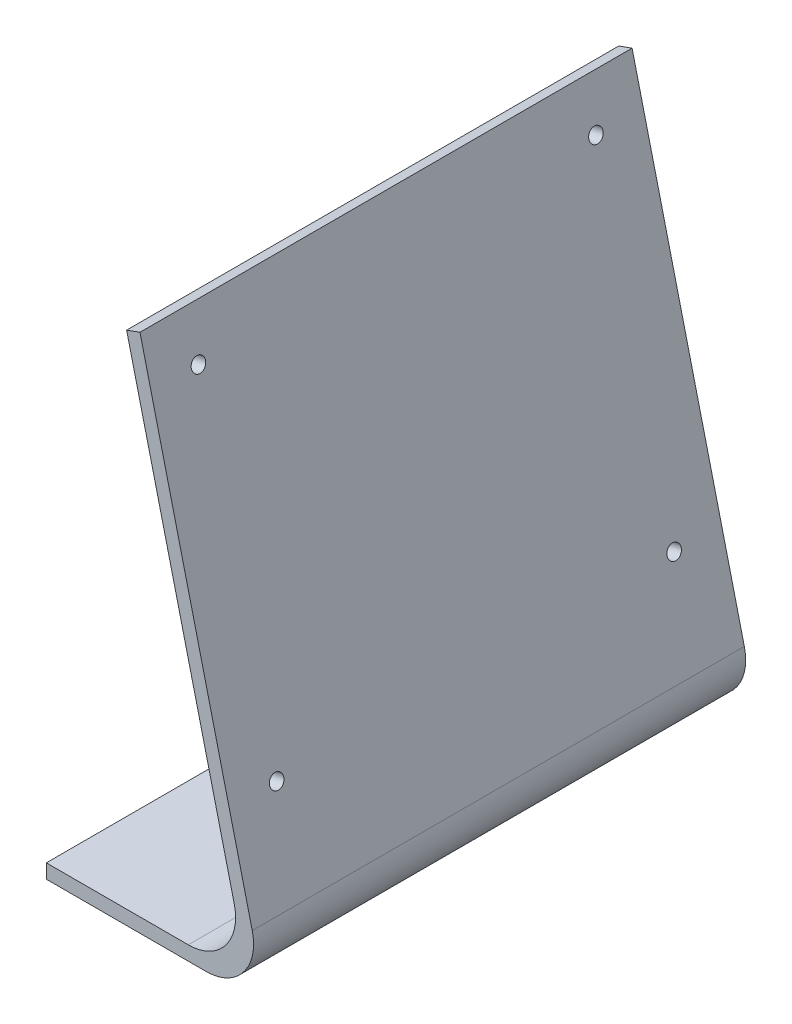
ISO-10303-21;
HEADER;
FILE_DESCRIPTION(('STEP AP214'),'2;1');
FILE_NAME('part.step','',(''),(''),'','','');
FILE_SCHEMA(('AUTOMOTIVE_DESIGN { 1 0 10303 214 1 1 1 1 }'));
ENDSEC;
DATA;
#1=APPLICATION_CONTEXT('core data for automotive mechanical design processes');
#2=APPLICATION_PROTOCOL_DEFINITION('international standard','automotive_design',2000,#1);
#3=PRODUCT_CONTEXT('',#1,'mechanical');
#4=PRODUCT('Part','Part','',(#3));
#5=PRODUCT_RELATED_PRODUCT_CATEGORY('part','',(#4));
#6=PRODUCT_DEFINITION_FORMATION('','',#4);
#7=PRODUCT_DEFINITION_CONTEXT('part definition',#1,'design');
#8=PRODUCT_DEFINITION('design','',#6,#7);
#9=PRODUCT_DEFINITION_SHAPE('','',#8);
#10=(LENGTH_UNIT() NAMED_UNIT(*) SI_UNIT(.MILLI.,.METRE.));
#11=(NAMED_UNIT(*) PLANE_ANGLE_UNIT() SI_UNIT($,.RADIAN.));
#12=(NAMED_UNIT(*) SI_UNIT($,.STERADIAN.) SOLID_ANGLE_UNIT());
#13=UNCERTAINTY_MEASURE_WITH_UNIT(LENGTH_MEASURE(1.E-05),#10,'distance_accuracy_value','');
#14=(GEOMETRIC_REPRESENTATION_CONTEXT(3) GLOBAL_UNCERTAINTY_ASSIGNED_CONTEXT((#13)) GLOBAL_UNIT_ASSIGNED_CONTEXT((#10,
#11,#12)) REPRESENTATION_CONTEXT('',''));
#15=CARTESIAN_POINT('',(0.,0.,0.));
#16=DIRECTION('',(0.,0.,1.));
#17=DIRECTION('',(1.,0.,0.));
#18=AXIS2_PLACEMENT_3D('',#15,#16,#17);
#19=CARTESIAN_POINT('',(-50.5300048316959,0.,52.));
#20=DIRECTION('',(0.,1.,0.));
#21=DIRECTION('',(0.,0.,1.));
#22=AXIS2_PLACEMENT_3D('',#19,#20,#21);
#23=PLANE('',#22);
#24=DIRECTION('',(1.,0.,0.));
#25=VECTOR('',#24,1.);
#26=CARTESIAN_POINT('',(-50.5300048316959,0.,-52.));
#27=LINE('',#26,#25);
#28=CARTESIAN_POINT('',(-50.5300048316959,0.,-52.));
#29=VERTEX_POINT('',#28);
#30=CARTESIAN_POINT('',(-16.7318655245927,0.,-52.));
#31=VERTEX_POINT('',#30);
#32=EDGE_CURVE('E133',#29,#31,#27,.T.);
#33=ORIENTED_EDGE('',*,*,#32,.T.);
#34=DIRECTION('',(0.,0.,-1.));
#35=VECTOR('',#34,1.);
#36=CARTESIAN_POINT('',(-16.7318655245927,0.,52.));
#37=LINE('',#36,#35);
#38=CARTESIAN_POINT('',(-16.7318655245927,0.,52.));
#39=VERTEX_POINT('',#38);
#40=EDGE_CURVE('E11',#39,#31,#37,.T.);
#41=ORIENTED_EDGE('',*,*,#40,.F.);
#42=DIRECTION('',(1.,0.,0.));
#43=VECTOR('',#42,1.);
#44=CARTESIAN_POINT('',(-50.5300048316959,0.,52.));
#45=LINE('',#44,#43);
#46=CARTESIAN_POINT('',(-50.5300048316959,0.,52.));
#47=VERTEX_POINT('',#46);
#48=EDGE_CURVE('E148',#47,#39,#45,.T.);
#49=ORIENTED_EDGE('',*,*,#48,.F.);
#50=DIRECTION('',(0.,0.,-1.));
#51=VECTOR('',#50,1.);
#52=CARTESIAN_POINT('',(-50.5300048316959,0.,52.));
#53=LINE('',#52,#51);
#54=EDGE_CURVE('E129',#47,#29,#53,.T.);
#55=ORIENTED_EDGE('',*,*,#54,.T.);
#56=EDGE_LOOP('',(#33,#41,#49,#55));
#57=FACE_BOUND('',#56,.T.);
#58=ADVANCED_FACE('F37',(#57),#23,.F.);
#59=CARTESIAN_POINT('',(-16.7318655245927,10.,52.));
#60=DIRECTION('',(0.,0.,-1.));
#61=DIRECTION('',(-1.,0.,0.));
#62=AXIS2_PLACEMENT_3D('',#59,#60,#61);
#63=CYLINDRICAL_SURFACE('',#62,10.);
#64=CARTESIAN_POINT('',(-16.7318655245927,10.,-52.));
#65=DIRECTION('',(0.,0.,1.));
#66=DIRECTION('',(1.,0.,0.));
#67=AXIS2_PLACEMENT_3D('',#64,#65,#66);
#68=CIRCLE('',#67,10.);
#69=CARTESIAN_POINT('',(-7.01457857653921,12.3610028312541,-52.));
#70=VERTEX_POINT('',#69);
#71=EDGE_CURVE('E136',#31,#70,#68,.T.);
#72=ORIENTED_EDGE('',*,*,#71,.T.);
#73=DIRECTION('',(0.,0.,-1.));
#74=VECTOR('',#73,1.);
#75=CARTESIAN_POINT('',(-7.01457857653921,12.3610028312541,52.));
#76=LINE('',#75,#74);
#77=CARTESIAN_POINT('',(-7.01457857653921,12.3610028312541,52.));
#78=VERTEX_POINT('',#77);
#79=EDGE_CURVE('E45',#78,#70,#76,.T.);
#80=ORIENTED_EDGE('',*,*,#79,.F.);
#81=CARTESIAN_POINT('',(-16.7318655245927,10.,52.));
#82=DIRECTION('',(0.,0.,1.));
#83=DIRECTION('',(1.,0.,0.));
#84=AXIS2_PLACEMENT_3D('',#81,#82,#83);
#85=CIRCLE('',#84,10.);
#86=EDGE_CURVE('E96',#39,#78,#85,.T.);
#87=ORIENTED_EDGE('',*,*,#86,.F.);
#88=ORIENTED_EDGE('',*,*,#40,.T.);
#89=EDGE_LOOP('',(#72,#80,#87,#88));
#90=FACE_BOUND('',#89,.T.);
#91=ADVANCED_FACE('F210',(#90),#63,.T.);
#92=CARTESIAN_POINT('',(-7.01457857653921,12.3610028312541,52.));
#93=DIRECTION('',(-0.971728694805345,-0.236100283125413,0.));
#94=DIRECTION('',(0.236100283125413,-0.971728694805346,0.));
#95=AXIS2_PLACEMENT_3D('',#92,#93,#94);
#96=PLANE('',#95);
#97=CARTESIAN_POINT('',(-11.8498389774818,32.2617044155723,42.));
#98=DIRECTION('',(0.971728694805345,0.236100283125413,0.));
#99=DIRECTION('',(0.236100283125413,-0.971728694805346,0.));
#100=AXIS2_PLACEMENT_3D('',#97,#98,#99);
#101=CIRCLE('',#100,1.5);
#102=CARTESIAN_POINT('',(-12.2039894021699,33.7192974577804,42.));
#103=VERTEX_POINT('',#102);
#104=EDGE_CURVE('E191',#103,#103,#101,.T.);
#105=ORIENTED_EDGE('',*,*,#104,.F.);
#106=EDGE_LOOP('',(#105));
#107=FACE_BOUND('',#106,.T.);
#108=CARTESIAN_POINT('',(-11.8498389774818,32.2617044155724,-42.));
#109=DIRECTION('',(0.971728694805345,0.236100283125413,0.));
#110=DIRECTION('',(-0.236100283125413,0.971728694805346,0.));
#111=AXIS2_PLACEMENT_3D('',#108,#109,#110);
#112=CIRCLE('',#111,1.5);
#113=CARTESIAN_POINT('',(-12.2039894021699,33.7192974577804,-42.));
#114=VERTEX_POINT('',#113);
#115=EDGE_CURVE('E190',#114,#114,#112,.T.);
#116=ORIENTED_EDGE('',*,*,#115,.F.);
#117=EDGE_LOOP('',(#116));
#118=FACE_BOUND('',#117,.T.);
#119=CARTESIAN_POINT('',(-28.3768587962607,100.282713051947,-42.));
#120=DIRECTION('',(0.971728694805345,0.236100283125413,0.));
#121=DIRECTION('',(0.236100283125413,-0.971728694805346,0.));
#122=AXIS2_PLACEMENT_3D('',#119,#120,#121);
#123=CIRCLE('',#122,1.5);
#124=CARTESIAN_POINT('',(-28.7310092209488,101.740306094155,-42.));
#125=VERTEX_POINT('',#124);
#126=EDGE_CURVE('E197',#125,#125,#123,.T.);
#127=ORIENTED_EDGE('',*,*,#126,.F.);
#128=EDGE_LOOP('',(#127));
#129=FACE_BOUND('',#128,.T.);
#130=CARTESIAN_POINT('',(-28.3768587962607,100.282713051947,42.));
#131=DIRECTION('',(0.971728694805345,0.236100283125413,0.));
#132=DIRECTION('',(-0.236100283125413,0.971728694805346,0.));
#133=AXIS2_PLACEMENT_3D('',#130,#131,#132);
#134=CIRCLE('',#133,1.5);
#135=CARTESIAN_POINT('',(-28.7310092209488,101.740306094155,42.));
#136=VERTEX_POINT('',#135);
#137=EDGE_CURVE('E183',#136,#136,#134,.T.);
#138=ORIENTED_EDGE('',*,*,#137,.F.);
#139=EDGE_LOOP('',(#138));
#140=FACE_BOUND('',#139,.T.);
#141=DIRECTION('',(-0.236100283125413,0.971728694805345,0.));
#142=VECTOR('',#141,1.);
#143=CARTESIAN_POINT('',(-7.01457857653921,12.3610028312541,-52.));
#144=LINE('',#143,#142);
#145=CARTESIAN_POINT('',(-30.7378616275148,110.,-52.));
#146=VERTEX_POINT('',#145);
#147=EDGE_CURVE('E139',#70,#146,#144,.T.);
#148=ORIENTED_EDGE('',*,*,#147,.T.);
#149=DIRECTION('',(0.,0.,-1.));
#150=VECTOR('',#149,1.);
#151=CARTESIAN_POINT('',(-30.7378616275148,110.,52.));
#152=LINE('',#151,#150);
#153=CARTESIAN_POINT('',(-30.7378616275148,110.,52.));
#154=VERTEX_POINT('',#153);
#155=EDGE_CURVE('E155',#154,#146,#152,.T.);
#156=ORIENTED_EDGE('',*,*,#155,.F.);
#157=DIRECTION('',(-0.236100283125413,0.971728694805345,0.));
#158=VECTOR('',#157,1.);
#159=CARTESIAN_POINT('',(-7.01457857653921,12.3610028312541,52.));
#160=LINE('',#159,#158);
#161=EDGE_CURVE('E163',#78,#154,#160,.T.);
#162=ORIENTED_EDGE('',*,*,#161,.F.);
#163=ORIENTED_EDGE('',*,*,#79,.T.);
#164=EDGE_LOOP('',(#148,#156,#162,#163));
#165=FACE_BOUND('',#164,.T.);
#166=ADVANCED_FACE('F161',(#107,#118,#129,#140,#165),#96,.F.);
#167=CARTESIAN_POINT('',(-30.7378616275148,110.,52.));
#168=DIRECTION('',(0.339644463777562,-0.940553899691693,0.));
#169=DIRECTION('',(0.940553899691693,0.339644463777562,0.));
#170=AXIS2_PLACEMENT_3D('',#167,#168,#169);
#171=PLANE('',#170);
#172=DIRECTION('',(-0.940553899691693,-0.339644463777562,0.));
#173=VECTOR('',#172,1.);
#174=CARTESIAN_POINT('',(-30.7378616275148,110.,-52.));
#175=LINE('',#174,#173);
#176=CARTESIAN_POINT('',(-33.5595233265899,108.981066608667,-52.));
#177=VERTEX_POINT('',#176);
#178=EDGE_CURVE('E141',#146,#177,#175,.T.);
#179=ORIENTED_EDGE('',*,*,#178,.T.);
#180=DIRECTION('',(0.,0.,-1.));
#181=VECTOR('',#180,1.);
#182=CARTESIAN_POINT('',(-33.5595233265899,108.981066608667,52.));
#183=LINE('',#182,#181);
#184=CARTESIAN_POINT('',(-33.5595233265899,108.981066608667,52.));
#185=VERTEX_POINT('',#184);
#186=EDGE_CURVE('E152',#185,#177,#183,.T.);
#187=ORIENTED_EDGE('',*,*,#186,.F.);
#188=DIRECTION('',(-0.940553899691693,-0.339644463777562,0.));
#189=VECTOR('',#188,1.);
#190=CARTESIAN_POINT('',(-30.7378616275148,110.,52.));
#191=LINE('',#190,#189);
#192=EDGE_CURVE('E175',#154,#185,#191,.T.);
#193=ORIENTED_EDGE('',*,*,#192,.F.);
#194=ORIENTED_EDGE('',*,*,#155,.T.);
#195=EDGE_LOOP('',(#179,#187,#193,#194));
#196=FACE_BOUND('',#195,.T.);
#197=ADVANCED_FACE('F171',(#196),#171,.F.);
#198=CARTESIAN_POINT('',(-33.5595233265899,108.981066608667,52.));
#199=DIRECTION('',(0.971728694805345,0.236100283125413,0.));
#200=DIRECTION('',(-0.236100283125413,0.971728694805346,0.));
#201=AXIS2_PLACEMENT_3D('',#198,#199,#200);
#202=PLANE('',#201);
#203=CARTESIAN_POINT('',(-14.7479810399055,31.5575447410317,42.));
#204=DIRECTION('',(0.971728694805345,0.236100283125413,0.));
#205=DIRECTION('',(-0.236100283125413,0.971728694805346,0.));
#206=AXIS2_PLACEMENT_3D('',#203,#204,#205);
#207=CIRCLE('',#206,1.5);
#208=CARTESIAN_POINT('',(-15.1021314645937,33.0151377832397,42.));
#209=VERTEX_POINT('',#208);
#210=EDGE_CURVE('E187',#209,#209,#207,.F.);
#211=ORIENTED_EDGE('',*,*,#210,.F.);
#212=EDGE_LOOP('',(#211));
#213=FACE_BOUND('',#212,.T.);
#214=CARTESIAN_POINT('',(-14.7479810399055,31.5575447410317,-42.));
#215=DIRECTION('',(0.971728694805345,0.236100283125413,0.));
#216=DIRECTION('',(-0.236100283125413,0.971728694805346,0.));
#217=AXIS2_PLACEMENT_3D('',#214,#215,#216);
#218=CIRCLE('',#217,1.5);
#219=CARTESIAN_POINT('',(-15.1021314645937,33.0151377832398,-42.));
#220=VERTEX_POINT('',#219);
#221=EDGE_CURVE('E194',#220,#220,#218,.F.);
#222=ORIENTED_EDGE('',*,*,#221,.F.);
#223=EDGE_LOOP('',(#222));
#224=FACE_BOUND('',#223,.T.);
#225=CARTESIAN_POINT('',(-31.2750008586844,99.5785533774059,-42.));
#226=DIRECTION('',(0.971728694805345,0.236100283125413,0.));
#227=DIRECTION('',(-0.236100283125413,0.971728694805346,0.));
#228=AXIS2_PLACEMENT_3D('',#225,#226,#227);
#229=CIRCLE('',#228,1.5);
#230=CARTESIAN_POINT('',(-31.6291512833725,101.036146419614,-42.));
#231=VERTEX_POINT('',#230);
#232=EDGE_CURVE('E186',#231,#231,#229,.F.);
#233=ORIENTED_EDGE('',*,*,#232,.F.);
#234=EDGE_LOOP('',(#233));
#235=FACE_BOUND('',#234,.T.);
#236=CARTESIAN_POINT('',(-31.2750008586844,99.5785533774059,42.));
#237=DIRECTION('',(0.971728694805345,0.236100283125413,0.));
#238=DIRECTION('',(-0.236100283125413,0.971728694805346,0.));
#239=AXIS2_PLACEMENT_3D('',#236,#237,#238);
#240=CIRCLE('',#239,1.5);
#241=CARTESIAN_POINT('',(-31.6291512833725,101.036146419614,42.));
#242=VERTEX_POINT('',#241);
#243=EDGE_CURVE('E137',#242,#242,#240,.F.);
#244=ORIENTED_EDGE('',*,*,#243,.F.);
#245=EDGE_LOOP('',(#244));
#246=FACE_BOUND('',#245,.T.);
#247=DIRECTION('',(0.236100283125413,-0.971728694805345,0.));
#248=VECTOR('',#247,1.);
#249=CARTESIAN_POINT('',(-33.5595233265899,108.981066608667,-52.));
#250=LINE('',#249,#248);
#251=CARTESIAN_POINT('',(-10.8127178836424,15.3610028312541,-52.));
#252=VERTEX_POINT('',#251);
#253=EDGE_CURVE('E143',#177,#252,#250,.T.);
#254=ORIENTED_EDGE('',*,*,#253,.T.);
#255=DIRECTION('',(0.,0.,-1.));
#256=VECTOR('',#255,1.);
#257=CARTESIAN_POINT('',(-10.8127178836424,15.3610028312541,52.));
#258=LINE('',#257,#256);
#259=CARTESIAN_POINT('',(-10.8127178836424,15.3610028312541,52.));
#260=VERTEX_POINT('',#259);
#261=EDGE_CURVE('E124',#260,#252,#258,.T.);
#262=ORIENTED_EDGE('',*,*,#261,.F.);
#263=DIRECTION('',(0.236100283125413,-0.971728694805345,0.));
#264=VECTOR('',#263,1.);
#265=CARTESIAN_POINT('',(-33.5595233265899,108.981066608667,52.));
#266=LINE('',#265,#264);
#267=EDGE_CURVE('E115',#185,#260,#266,.T.);
#268=ORIENTED_EDGE('',*,*,#267,.F.);
#269=ORIENTED_EDGE('',*,*,#186,.T.);
#270=EDGE_LOOP('',(#254,#262,#268,#269));
#271=FACE_BOUND('',#270,.T.);
#272=ADVANCED_FACE('F174',(#213,#224,#235,#246,#271),#202,.F.);
#273=CARTESIAN_POINT('',(-20.5300048316959,13.,52.));
#274=DIRECTION('',(0.,0.,-1.));
#275=DIRECTION('',(-1.,0.,0.));
#276=AXIS2_PLACEMENT_3D('',#273,#274,#275);
#277=CYLINDRICAL_SURFACE('',#276,10.);
#278=CARTESIAN_POINT('',(-20.5300048316959,13.,-52.));
#279=DIRECTION('',(0.,0.,-1.));
#280=DIRECTION('',(-1.,0.,0.));
#281=AXIS2_PLACEMENT_3D('',#278,#279,#280);
#282=CIRCLE('',#281,10.);
#283=CARTESIAN_POINT('',(-20.5300048316959,3.,-52.));
#284=VERTEX_POINT('',#283);
#285=EDGE_CURVE('E123',#252,#284,#282,.T.);
#286=ORIENTED_EDGE('',*,*,#285,.T.);
#287=DIRECTION('',(0.,0.,-1.));
#288=VECTOR('',#287,1.);
#289=CARTESIAN_POINT('',(-20.5300048316959,3.,52.));
#290=LINE('',#289,#288);
#291=CARTESIAN_POINT('',(-20.5300048316959,3.,52.));
#292=VERTEX_POINT('',#291);
#293=EDGE_CURVE('E120',#292,#284,#290,.T.);
#294=ORIENTED_EDGE('',*,*,#293,.F.);
#295=CARTESIAN_POINT('',(-20.5300048316959,13.,52.));
#296=DIRECTION('',(0.,0.,-1.));
#297=DIRECTION('',(-1.,0.,0.));
#298=AXIS2_PLACEMENT_3D('',#295,#296,#297);
#299=CIRCLE('',#298,10.);
#300=EDGE_CURVE('E109',#260,#292,#299,.T.);
#301=ORIENTED_EDGE('',*,*,#300,.F.);
#302=ORIENTED_EDGE('',*,*,#261,.T.);
#303=EDGE_LOOP('',(#286,#294,#301,#302));
#304=FACE_BOUND('',#303,.T.);
#305=ADVANCED_FACE('F121',(#304),#277,.F.);
#306=CARTESIAN_POINT('',(-50.5300048316959,3.,52.));
#307=DIRECTION('',(0.,-1.,0.));
#308=DIRECTION('',(1.,0.,0.));
#309=AXIS2_PLACEMENT_3D('',#306,#307,#308);
#310=PLANE('',#309);
#311=DIRECTION('',(-1.,0.,0.));
#312=VECTOR('',#311,1.);
#313=CARTESIAN_POINT('',(-50.5300048316959,3.,-52.));
#314=LINE('',#313,#312);
#315=CARTESIAN_POINT('',(-50.5300048316959,3.,-52.));
#316=VERTEX_POINT('',#315);
#317=EDGE_CURVE('E82',#284,#316,#314,.T.);
#318=ORIENTED_EDGE('',*,*,#317,.T.);
#319=DIRECTION('',(0.,0.,-1.));
#320=VECTOR('',#319,1.);
#321=CARTESIAN_POINT('',(-50.5300048316959,3.,52.));
#322=LINE('',#321,#320);
#323=CARTESIAN_POINT('',(-50.5300048316959,3.,52.));
#324=VERTEX_POINT('',#323);
#325=EDGE_CURVE('E125',#324,#316,#322,.T.);
#326=ORIENTED_EDGE('',*,*,#325,.F.);
#327=DIRECTION('',(-1.,0.,0.));
#328=VECTOR('',#327,1.);
#329=CARTESIAN_POINT('',(-50.5300048316959,3.,52.));
#330=LINE('',#329,#328);
#331=EDGE_CURVE('E113',#292,#324,#330,.T.);
#332=ORIENTED_EDGE('',*,*,#331,.F.);
#333=ORIENTED_EDGE('',*,*,#293,.T.);
#334=EDGE_LOOP('',(#318,#326,#332,#333));
#335=FACE_BOUND('',#334,.T.);
#336=ADVANCED_FACE('F127',(#335),#310,.F.);
#337=CARTESIAN_POINT('',(-50.5300048316959,0.,52.));
#338=DIRECTION('',(1.,0.,0.));
#339=DIRECTION('',(0.,0.,-1.));
#340=AXIS2_PLACEMENT_3D('',#337,#338,#339);
#341=PLANE('',#340);
#342=DIRECTION('',(0.,-1.,0.));
#343=VECTOR('',#342,1.);
#344=CARTESIAN_POINT('',(-50.5300048316959,0.,-52.));
#345=LINE('',#344,#343);
#346=EDGE_CURVE('E88',#316,#29,#345,.T.);
#347=ORIENTED_EDGE('',*,*,#346,.T.);
#348=ORIENTED_EDGE('',*,*,#54,.F.);
#349=DIRECTION('',(0.,-1.,0.));
#350=VECTOR('',#349,1.);
#351=CARTESIAN_POINT('',(-50.5300048316959,0.,52.));
#352=LINE('',#351,#350);
#353=EDGE_CURVE('E53',#324,#47,#352,.T.);
#354=ORIENTED_EDGE('',*,*,#353,.F.);
#355=ORIENTED_EDGE('',*,*,#325,.T.);
#356=EDGE_LOOP('',(#347,#348,#354,#355));
#357=FACE_BOUND('',#356,.T.);
#358=ADVANCED_FACE('F239',(#357),#341,.F.);
#359=CARTESIAN_POINT('',(-16.7318655245927,10.,52.));
#360=DIRECTION('',(0.,0.,1.));
#361=DIRECTION('',(1.,0.,0.));
#362=AXIS2_PLACEMENT_3D('',#359,#360,#361);
#363=PLANE('',#362);
#364=ORIENTED_EDGE('',*,*,#48,.T.);
#365=ORIENTED_EDGE('',*,*,#86,.T.);
#366=ORIENTED_EDGE('',*,*,#161,.T.);
#367=ORIENTED_EDGE('',*,*,#192,.T.);
#368=ORIENTED_EDGE('',*,*,#267,.T.);
#369=ORIENTED_EDGE('',*,*,#300,.T.);
#370=ORIENTED_EDGE('',*,*,#331,.T.);
#371=ORIENTED_EDGE('',*,*,#353,.T.);
#372=EDGE_LOOP('',(#364,#365,#366,#367,#368,#369,#370,#371));
#373=FACE_BOUND('',#372,.T.);
#374=ADVANCED_FACE('F111',(#373),#363,.T.);
#375=CARTESIAN_POINT('',(-16.7318655245927,10.,-52.));
#376=DIRECTION('',(0.,0.,1.));
#377=DIRECTION('',(1.,0.,0.));
#378=AXIS2_PLACEMENT_3D('',#375,#376,#377);
#379=PLANE('',#378);
#380=ORIENTED_EDGE('',*,*,#32,.F.);
#381=ORIENTED_EDGE('',*,*,#346,.F.);
#382=ORIENTED_EDGE('',*,*,#317,.F.);
#383=ORIENTED_EDGE('',*,*,#285,.F.);
#384=ORIENTED_EDGE('',*,*,#253,.F.);
#385=ORIENTED_EDGE('',*,*,#178,.F.);
#386=ORIENTED_EDGE('',*,*,#147,.F.);
#387=ORIENTED_EDGE('',*,*,#71,.F.);
#388=EDGE_LOOP('',(#380,#381,#382,#383,#384,#385,#386,#387));
#389=FACE_BOUND('',#388,.T.);
#390=ADVANCED_FACE('F167',(#389),#379,.F.);
#391=CARTESIAN_POINT('',(-72.3036916375974,89.6098393104546,42.));
#392=DIRECTION('',(0.971728694805345,0.236100283125413,0.));
#393=DIRECTION('',(-0.236100283125413,0.971728694805345,0.));
#394=AXIS2_PLACEMENT_3D('',#391,#392,#393);
#395=CYLINDRICAL_SURFACE('',#394,1.5);
#396=CARTESIAN_POINT('',(-28.7310092209488,101.740306094155,42.));
#397=CARTESIAN_POINT('',(-28.7611982007657,101.732971097545,42.));
#398=CARTESIAN_POINT('',(-28.7913871805826,101.725636100935,42.));
#399=CARTESIAN_POINT('',(-28.8517651402164,101.710966107715,42.));
#400=CARTESIAN_POINT('',(-28.8819541200334,101.703631111106,42.));
#401=CARTESIAN_POINT('',(-28.9423320796672,101.688961117886,42.));
#402=CARTESIAN_POINT('',(-28.9725210594841,101.681626121276,42.));
#403=CARTESIAN_POINT('',(-29.0328990191179,101.666956128057,42.));
#404=CARTESIAN_POINT('',(-29.0630879989348,101.659621131447,42.));
#405=CARTESIAN_POINT('',(-29.1234659585687,101.644951138227,42.));
#406=CARTESIAN_POINT('',(-29.1536549383856,101.637616141617,42.));
#407=CARTESIAN_POINT('',(-29.2140328980194,101.622946148398,42.));
#408=CARTESIAN_POINT('',(-29.2442218778363,101.615611151788,42.));
#409=CARTESIAN_POINT('',(-29.3045998374702,101.600941158568,42.));
#410=CARTESIAN_POINT('',(-29.3347888172871,101.593606161959,42.));
#411=CARTESIAN_POINT('',(-29.3951667769209,101.578936168739,42.));
#412=CARTESIAN_POINT('',(-29.4253557567378,101.571601172129,42.));
#413=CARTESIAN_POINT('',(-29.4857337163716,101.55693117891,42.));
#414=CARTESIAN_POINT('',(-29.5159226961886,101.5495961823,42.));
#415=CARTESIAN_POINT('',(-29.5763006558224,101.53492618908,42.));
#416=CARTESIAN_POINT('',(-29.6064896356393,101.52759119247,42.));
#417=CARTESIAN_POINT('',(-29.6668675952731,101.512921199251,42.));
#418=CARTESIAN_POINT('',(-29.69705657509,101.505586202641,42.));
#419=CARTESIAN_POINT('',(-29.7574345347239,101.490916209421,42.));
#420=CARTESIAN_POINT('',(-29.7876235145408,101.483581212812,42.));
#421=CARTESIAN_POINT('',(-29.8480014741746,101.468911219592,42.));
#422=CARTESIAN_POINT('',(-29.8781904539915,101.461576222982,42.));
#423=CARTESIAN_POINT('',(-29.9385684136254,101.446906229763,42.));
#424=CARTESIAN_POINT('',(-29.9687573934423,101.439571233153,42.));
#425=CARTESIAN_POINT('',(-30.0291353530761,101.424901239933,42.));
#426=CARTESIAN_POINT('',(-30.059324332893,101.417566243323,42.));
#427=CARTESIAN_POINT('',(-30.1197022925268,101.402896250104,42.));
#428=CARTESIAN_POINT('',(-30.1498912723438,101.395561253494,42.));
#429=CARTESIAN_POINT('',(-30.2102692319776,101.380891260274,42.));
#430=CARTESIAN_POINT('',(-30.2404582117945,101.373556263665,42.));
#431=CARTESIAN_POINT('',(-30.3008361714283,101.358886270445,42.));
#432=CARTESIAN_POINT('',(-30.3310251512452,101.351551273835,42.));
#433=CARTESIAN_POINT('',(-30.3914031108791,101.336881280616,42.));
#434=CARTESIAN_POINT('',(-30.421592090696,101.329546284006,42.));
#435=CARTESIAN_POINT('',(-30.4819700503298,101.314876290786,42.));
#436=CARTESIAN_POINT('',(-30.5121590301467,101.307541294176,42.));
#437=CARTESIAN_POINT('',(-30.5725369897806,101.292871300957,42.));
#438=CARTESIAN_POINT('',(-30.6027259695975,101.285536304347,42.));
#439=CARTESIAN_POINT('',(-30.6631039292313,101.270866311128,42.));
#440=CARTESIAN_POINT('',(-30.6932929090482,101.263531314518,42.));
#441=CARTESIAN_POINT('',(-30.753670868682,101.248861321298,42.));
#442=CARTESIAN_POINT('',(-30.7838598484989,101.241526324688,42.));
#443=CARTESIAN_POINT('',(-30.8442378081328,101.226856331469,42.));
#444=CARTESIAN_POINT('',(-30.8744267879497,101.219521334859,42.));
#445=CARTESIAN_POINT('',(-30.9348047475835,101.204851341639,42.));
#446=CARTESIAN_POINT('',(-30.9649937274004,101.19751634503,42.));
#447=CARTESIAN_POINT('',(-31.0253716870343,101.18284635181,42.));
#448=CARTESIAN_POINT('',(-31.0555606668512,101.1755113552,42.));
#449=CARTESIAN_POINT('',(-31.115938626485,101.160841361981,42.));
#450=CARTESIAN_POINT('',(-31.1461276063019,101.153506365371,42.));
#451=CARTESIAN_POINT('',(-31.2065055659357,101.138836372151,42.));
#452=CARTESIAN_POINT('',(-31.2366945457527,101.131501375541,42.));
#453=CARTESIAN_POINT('',(-31.2970725053865,101.116831382322,42.));
#454=CARTESIAN_POINT('',(-31.3272614852034,101.109496385712,42.));
#455=CARTESIAN_POINT('',(-31.3876394448372,101.094826392492,42.));
#456=CARTESIAN_POINT('',(-31.4178284246541,101.087491395883,42.));
#457=CARTESIAN_POINT('',(-31.478206384288,101.072821402663,42.));
#458=CARTESIAN_POINT('',(-31.5083953641049,101.065486406053,42.));
#459=CARTESIAN_POINT('',(-31.5687733237387,101.050816412834,42.));
#460=CARTESIAN_POINT('',(-31.5989623035556,101.043481416224,42.));
#461=CARTESIAN_POINT('',(-31.6291512833725,101.036146419614,42.));
#462=B_SPLINE_CURVE_WITH_KNOTS('',3,(#396,#397,#398,#399,#400,#401,#402,#403,#404,#405,#406,
#407,#408,#409,#410,#411,#412,#413,#414,#415,#416,#417,#418,#419,#420,#421,#422,#423,#424,#425,
#426,#427,#428,#429,#430,#431,#432,#433,#434,#435,#436,#437,#438,#439,#440,#441,#442,#443,#444,
#445,#446,#447,#448,#449,#450,#451,#452,#453,#454,#455,#456,#457,#458,#459,#460,#461),
.UNSPECIFIED.,.F.,.F.,(4,2,2,2,2,2,2,2,2,2,2,2,2,2,2,2,2,2,2,2,2,2,2,2,2,2,2,2,2,2,2,2,4),(0.,
0.0932018781938731,0.186403756387749,0.279605634581623,0.372807512775502,0.466009390969382,
0.559211269163258,0.652413147357132,0.745615025551005,0.838816903744884,0.932018781938761,
1.02522066013263,1.11842253832651,1.21162441652039,1.30482629471427,1.39802817290814,
1.49123005110202,1.5844319292959,1.67763380748977,1.77083568568365,1.86403756387753,
1.9572394420714,2.05044132026528,2.14364319845915,2.23684507665303,2.33004695484691,
2.42324883304078,2.51645071123465,2.60965258942854,2.70285446762242,2.79605634581629,
2.88925822401016,2.98246010220404),.UNSPECIFIED.);
#463=EDGE_CURVE('BSEAM215',#136,#242,#462,.T.);
#464=ORIENTED_EDGE('',*,*,#137,.T.);
#465=ORIENTED_EDGE('',*,*,#243,.T.);
#466=ORIENTED_EDGE('',*,*,#463,.T.);
#467=ORIENTED_EDGE('',*,*,#463,.F.);
#468=EDGE_LOOP('',(#464,#466,#465,#467));
#469=FACE_BOUND('',#468,.T.);
#470=ADVANCED_FACE('F215',(#469),#395,.F.);
#471=CARTESIAN_POINT('',(-72.3036916375974,89.6098393104546,-42.));
#472=DIRECTION('',(0.971728694805345,0.236100283125413,0.));
#473=DIRECTION('',(-0.236100283125413,0.971728694805345,0.));
#474=AXIS2_PLACEMENT_3D('',#471,#472,#473);
#475=CYLINDRICAL_SURFACE('',#474,1.5);
#476=CARTESIAN_POINT('',(-28.7310092209488,101.740306094155,-42.));
#477=CARTESIAN_POINT('',(-28.7611982007657,101.732971097545,-42.));
#478=CARTESIAN_POINT('',(-28.7913871805826,101.725636100935,-42.));
#479=CARTESIAN_POINT('',(-28.8517651402164,101.710966107715,-42.));
#480=CARTESIAN_POINT('',(-28.8819541200334,101.703631111106,-42.));
#481=CARTESIAN_POINT('',(-28.9423320796672,101.688961117886,-42.));
#482=CARTESIAN_POINT('',(-28.9725210594841,101.681626121276,-42.));
#483=CARTESIAN_POINT('',(-29.0328990191179,101.666956128057,-42.));
#484=CARTESIAN_POINT('',(-29.0630879989348,101.659621131447,-42.));
#485=CARTESIAN_POINT('',(-29.1234659585687,101.644951138227,-42.));
#486=CARTESIAN_POINT('',(-29.1536549383856,101.637616141617,-42.));
#487=CARTESIAN_POINT('',(-29.2140328980194,101.622946148398,-42.));
#488=CARTESIAN_POINT('',(-29.2442218778363,101.615611151788,-42.));
#489=CARTESIAN_POINT('',(-29.3045998374702,101.600941158568,-42.));
#490=CARTESIAN_POINT('',(-29.3347888172871,101.593606161959,-42.));
#491=CARTESIAN_POINT('',(-29.3951667769209,101.578936168739,-42.));
#492=CARTESIAN_POINT('',(-29.4253557567378,101.571601172129,-42.));
#493=CARTESIAN_POINT('',(-29.4857337163716,101.55693117891,-42.));
#494=CARTESIAN_POINT('',(-29.5159226961886,101.5495961823,-42.));
#495=CARTESIAN_POINT('',(-29.5763006558224,101.53492618908,-42.));
#496=CARTESIAN_POINT('',(-29.6064896356393,101.52759119247,-42.));
#497=CARTESIAN_POINT('',(-29.6668675952731,101.512921199251,-42.));
#498=CARTESIAN_POINT('',(-29.69705657509,101.505586202641,-42.));
#499=CARTESIAN_POINT('',(-29.7574345347239,101.490916209421,-42.));
#500=CARTESIAN_POINT('',(-29.7876235145408,101.483581212812,-42.));
#501=CARTESIAN_POINT('',(-29.8480014741746,101.468911219592,-42.));
#502=CARTESIAN_POINT('',(-29.8781904539915,101.461576222982,-42.));
#503=CARTESIAN_POINT('',(-29.9385684136254,101.446906229763,-42.));
#504=CARTESIAN_POINT('',(-29.9687573934423,101.439571233153,-42.));
#505=CARTESIAN_POINT('',(-30.0291353530761,101.424901239933,-42.));
#506=CARTESIAN_POINT('',(-30.059324332893,101.417566243323,-42.));
#507=CARTESIAN_POINT('',(-30.1197022925268,101.402896250104,-42.));
#508=CARTESIAN_POINT('',(-30.1498912723438,101.395561253494,-42.));
#509=CARTESIAN_POINT('',(-30.2102692319776,101.380891260274,-42.));
#510=CARTESIAN_POINT('',(-30.2404582117945,101.373556263665,-42.));
#511=CARTESIAN_POINT('',(-30.3008361714283,101.358886270445,-42.));
#512=CARTESIAN_POINT('',(-30.3310251512452,101.351551273835,-42.));
#513=CARTESIAN_POINT('',(-30.3914031108791,101.336881280616,-42.));
#514=CARTESIAN_POINT('',(-30.421592090696,101.329546284006,-42.));
#515=CARTESIAN_POINT('',(-30.4819700503298,101.314876290786,-42.));
#516=CARTESIAN_POINT('',(-30.5121590301467,101.307541294176,-42.));
#517=CARTESIAN_POINT('',(-30.5725369897806,101.292871300957,-42.));
#518=CARTESIAN_POINT('',(-30.6027259695975,101.285536304347,-42.));
#519=CARTESIAN_POINT('',(-30.6631039292313,101.270866311128,-42.));
#520=CARTESIAN_POINT('',(-30.6932929090482,101.263531314518,-42.));
#521=CARTESIAN_POINT('',(-30.753670868682,101.248861321298,-42.));
#522=CARTESIAN_POINT('',(-30.7838598484989,101.241526324688,-42.));
#523=CARTESIAN_POINT('',(-30.8442378081328,101.226856331469,-42.));
#524=CARTESIAN_POINT('',(-30.8744267879497,101.219521334859,-42.));
#525=CARTESIAN_POINT('',(-30.9348047475835,101.204851341639,-42.));
#526=CARTESIAN_POINT('',(-30.9649937274004,101.19751634503,-42.));
#527=CARTESIAN_POINT('',(-31.0253716870343,101.18284635181,-42.));
#528=CARTESIAN_POINT('',(-31.0555606668512,101.1755113552,-42.));
#529=CARTESIAN_POINT('',(-31.115938626485,101.160841361981,-42.));
#530=CARTESIAN_POINT('',(-31.1461276063019,101.153506365371,-42.));
#531=CARTESIAN_POINT('',(-31.2065055659357,101.138836372151,-42.));
#532=CARTESIAN_POINT('',(-31.2366945457527,101.131501375541,-42.));
#533=CARTESIAN_POINT('',(-31.2970725053865,101.116831382322,-42.));
#534=CARTESIAN_POINT('',(-31.3272614852034,101.109496385712,-42.));
#535=CARTESIAN_POINT('',(-31.3876394448372,101.094826392492,-42.));
#536=CARTESIAN_POINT('',(-31.4178284246541,101.087491395883,-42.));
#537=CARTESIAN_POINT('',(-31.478206384288,101.072821402663,-42.));
#538=CARTESIAN_POINT('',(-31.5083953641049,101.065486406053,-42.));
#539=CARTESIAN_POINT('',(-31.5687733237387,101.050816412834,-42.));
#540=CARTESIAN_POINT('',(-31.5989623035556,101.043481416224,-42.));
#541=CARTESIAN_POINT('',(-31.6291512833725,101.036146419614,-42.));
#542=B_SPLINE_CURVE_WITH_KNOTS('',3,(#476,#477,#478,#479,#480,#481,#482,#483,#484,#485,#486,
#487,#488,#489,#490,#491,#492,#493,#494,#495,#496,#497,#498,#499,#500,#501,#502,#503,#504,#505,
#506,#507,#508,#509,#510,#511,#512,#513,#514,#515,#516,#517,#518,#519,#520,#521,#522,#523,#524,
#525,#526,#527,#528,#529,#530,#531,#532,#533,#534,#535,#536,#537,#538,#539,#540,#541),
.UNSPECIFIED.,.F.,.F.,(4,2,2,2,2,2,2,2,2,2,2,2,2,2,2,2,2,2,2,2,2,2,2,2,2,2,2,2,2,2,2,2,4),(0.,
0.0932018781938731,0.186403756387749,0.279605634581623,0.372807512775502,0.466009390969382,
0.559211269163258,0.652413147357132,0.745615025551005,0.838816903744884,0.932018781938761,
1.02522066013263,1.11842253832651,1.21162441652039,1.30482629471427,1.39802817290814,
1.49123005110202,1.5844319292959,1.67763380748977,1.77083568568365,1.86403756387753,
1.9572394420714,2.05044132026528,2.14364319845915,2.23684507665303,2.33004695484691,
2.42324883304078,2.51645071123465,2.60965258942854,2.70285446762242,2.79605634581629,
2.88925822401016,2.98246010220404),.UNSPECIFIED.);
#543=EDGE_CURVE('BSEAM205',#125,#231,#542,.T.);
#544=ORIENTED_EDGE('',*,*,#126,.T.);
#545=ORIENTED_EDGE('',*,*,#232,.T.);
#546=ORIENTED_EDGE('',*,*,#543,.T.);
#547=ORIENTED_EDGE('',*,*,#543,.F.);
#548=EDGE_LOOP('',(#544,#546,#545,#547));
#549=FACE_BOUND('',#548,.T.);
#550=ADVANCED_FACE('F205',(#549),#475,.F.);
#551=CARTESIAN_POINT('',(-55.7766718188185,21.5888306740804,-42.));
#552=DIRECTION('',(0.971728694805345,0.236100283125413,0.));
#553=DIRECTION('',(-0.236100283125413,0.971728694805345,0.));
#554=AXIS2_PLACEMENT_3D('',#551,#552,#553);
#555=CYLINDRICAL_SURFACE('',#554,1.5);
#556=CARTESIAN_POINT('',(-12.2039894021699,33.7192974577804,-42.));
#557=CARTESIAN_POINT('',(-12.2341783819868,33.7119624611706,-42.));
#558=CARTESIAN_POINT('',(-12.2643673618037,33.7046274645608,-42.));
#559=CARTESIAN_POINT('',(-12.3247453214375,33.6899574713412,-42.));
#560=CARTESIAN_POINT('',(-12.3549343012545,33.6826224747314,-42.));
#561=CARTESIAN_POINT('',(-12.4153122608883,33.6679524815118,-42.));
#562=CARTESIAN_POINT('',(-12.4455012407052,33.660617484902,-42.));
#563=CARTESIAN_POINT('',(-12.505879200339,33.6459474916824,-42.));
#564=CARTESIAN_POINT('',(-12.5360681801559,33.6386124950726,-42.));
#565=CARTESIAN_POINT('',(-12.5964461397898,33.623942501853,-42.));
#566=CARTESIAN_POINT('',(-12.6266351196067,33.6166075052432,-42.));
#567=CARTESIAN_POINT('',(-12.6870130792405,33.6019375120236,-42.));
#568=CARTESIAN_POINT('',(-12.7172020590574,33.5946025154138,-42.));
#569=CARTESIAN_POINT('',(-12.7775800186913,33.5799325221942,-42.));
#570=CARTESIAN_POINT('',(-12.8077689985082,33.5725975255844,-42.));
#571=CARTESIAN_POINT('',(-12.868146958142,33.5579275323648,-42.));
#572=CARTESIAN_POINT('',(-12.8983359379589,33.550592535755,-42.));
#573=CARTESIAN_POINT('',(-12.9587138975928,33.5359225425354,-42.));
#574=CARTESIAN_POINT('',(-12.9889028774097,33.5285875459256,-42.));
#575=CARTESIAN_POINT('',(-13.0492808370435,33.513917552706,-42.));
#576=CARTESIAN_POINT('',(-13.0794698168604,33.5065825560962,-42.));
#577=CARTESIAN_POINT('',(-13.1398477764942,33.4919125628766,-42.));
#578=CARTESIAN_POINT('',(-13.1700367563111,33.4845775662669,-42.));
#579=CARTESIAN_POINT('',(-13.230414715945,33.4699075730473,-42.));
#580=CARTESIAN_POINT('',(-13.2606036957619,33.4625725764375,-42.));
#581=CARTESIAN_POINT('',(-13.3209816553957,33.4479025832179,-42.));
#582=CARTESIAN_POINT('',(-13.3511706352126,33.4405675866081,-42.));
#583=CARTESIAN_POINT('',(-13.4115485948465,33.4258975933885,-42.));
#584=CARTESIAN_POINT('',(-13.4417375746634,33.4185625967787,-42.));
#585=CARTESIAN_POINT('',(-13.5021155342972,33.4038926035591,-42.));
#586=CARTESIAN_POINT('',(-13.5323045141141,33.3965576069493,-42.));
#587=CARTESIAN_POINT('',(-13.592682473748,33.3818876137297,-42.));
#588=CARTESIAN_POINT('',(-13.6228714535649,33.3745526171199,-42.));
#589=CARTESIAN_POINT('',(-13.6832494131987,33.3598826239003,-42.));
#590=CARTESIAN_POINT('',(-13.7134383930156,33.3525476272905,-42.));
#591=CARTESIAN_POINT('',(-13.7738163526494,33.3378776340709,-42.));
#592=CARTESIAN_POINT('',(-13.8040053324663,33.3305426374611,-42.));
#593=CARTESIAN_POINT('',(-13.8643832921002,33.3158726442415,-42.));
#594=CARTESIAN_POINT('',(-13.8945722719171,33.3085376476317,-42.));
#595=CARTESIAN_POINT('',(-13.9549502315509,33.2938676544121,-42.));
#596=CARTESIAN_POINT('',(-13.9851392113678,33.2865326578023,-42.));
#597=CARTESIAN_POINT('',(-14.0455171710017,33.2718626645827,-42.));
#598=CARTESIAN_POINT('',(-14.0757061508186,33.2645276679729,-42.));
#599=CARTESIAN_POINT('',(-14.1360841104524,33.2498576747533,-42.));
#600=CARTESIAN_POINT('',(-14.1662730902693,33.2425226781435,-42.));
#601=CARTESIAN_POINT('',(-14.2266510499032,33.2278526849239,-42.));
#602=CARTESIAN_POINT('',(-14.2568400297201,33.2205176883141,-42.));
#603=CARTESIAN_POINT('',(-14.3172179893539,33.2058476950945,-42.));
#604=CARTESIAN_POINT('',(-14.3474069691708,33.1985126984847,-42.));
#605=CARTESIAN_POINT('',(-14.4077849288046,33.1838427052651,-42.));
#606=CARTESIAN_POINT('',(-14.4379739086216,33.1765077086553,-42.));
#607=CARTESIAN_POINT('',(-14.4983518682554,33.1618377154357,-42.));
#608=CARTESIAN_POINT('',(-14.5285408480723,33.1545027188259,-42.));
#609=CARTESIAN_POINT('',(-14.5889188077061,33.1398327256063,-42.));
#610=CARTESIAN_POINT('',(-14.619107787523,33.1324977289965,-42.));
#611=CARTESIAN_POINT('',(-14.6794857471569,33.1178277357769,-42.));
#612=CARTESIAN_POINT('',(-14.7096747269738,33.1104927391671,-42.));
#613=CARTESIAN_POINT('',(-14.7700526866076,33.0958227459475,-42.));
#614=CARTESIAN_POINT('',(-14.8002416664245,33.0884877493377,-42.));
#615=CARTESIAN_POINT('',(-14.8606196260584,33.0738177561181,-42.));
#616=CARTESIAN_POINT('',(-14.8908086058753,33.0664827595083,-42.));
#617=CARTESIAN_POINT('',(-14.9511865655091,33.0518127662887,-42.));
#618=CARTESIAN_POINT('',(-14.981375545326,33.044477769679,-42.));
#619=CARTESIAN_POINT('',(-15.0417535049598,33.0298077764594,-42.));
#620=CARTESIAN_POINT('',(-15.0719424847768,33.0224727798496,-42.));
#621=CARTESIAN_POINT('',(-15.1021314645937,33.0151377832398,-42.));
#622=B_SPLINE_CURVE_WITH_KNOTS('',3,(#556,#557,#558,#559,#560,#561,#562,#563,#564,#565,#566,
#567,#568,#569,#570,#571,#572,#573,#574,#575,#576,#577,#578,#579,#580,#581,#582,#583,#584,#585,
#586,#587,#588,#589,#590,#591,#592,#593,#594,#595,#596,#597,#598,#599,#600,#601,#602,#603,#604,
#605,#606,#607,#608,#609,#610,#611,#612,#613,#614,#615,#616,#617,#618,#619,#620,#621),
.UNSPECIFIED.,.F.,.F.,(4,2,2,2,2,2,2,2,2,2,2,2,2,2,2,2,2,2,2,2,2,2,2,2,2,2,2,2,2,2,2,2,4),(0.,
0.0932018781938747,0.186403756387748,0.279605634581628,0.372807512775502,0.466009390969382,
0.559211269163264,0.652413147357137,0.745615025551018,0.838816903744893,0.932018781938766,
1.02522066013265,1.11842253832653,1.2116244165204,1.30482629471428,1.39802817290816,
1.49123005110203,1.58443192929591,1.67763380748978,1.77083568568366,1.86403756387754,
1.95723944207142,2.0504413202653,2.14364319845917,2.23684507665305,2.33004695484693,
2.4232488330408,2.51645071123468,2.60965258942856,2.70285446762244,2.79605634581631,
2.88925822401018,2.98246010220407),.UNSPECIFIED.);
#623=EDGE_CURVE('BSEAM254',#114,#220,#622,.T.);
#624=ORIENTED_EDGE('',*,*,#115,.T.);
#625=ORIENTED_EDGE('',*,*,#221,.T.);
#626=ORIENTED_EDGE('',*,*,#623,.T.);
#627=ORIENTED_EDGE('',*,*,#623,.F.);
#628=EDGE_LOOP('',(#624,#626,#625,#627));
#629=FACE_BOUND('',#628,.T.);
#630=ADVANCED_FACE('F254',(#629),#555,.F.);
#631=CARTESIAN_POINT('',(-55.7766718188184,21.5888306740803,42.));
#632=DIRECTION('',(0.971728694805345,0.236100283125413,0.));
#633=DIRECTION('',(-0.236100283125413,0.971728694805345,0.));
#634=AXIS2_PLACEMENT_3D('',#631,#632,#633);
#635=CYLINDRICAL_SURFACE('',#634,1.5);
#636=CARTESIAN_POINT('',(-12.2039894021699,33.7192974577804,42.));
#637=CARTESIAN_POINT('',(-12.2341783819868,33.7119624611706,42.));
#638=CARTESIAN_POINT('',(-12.2643673618037,33.7046274645608,42.));
#639=CARTESIAN_POINT('',(-12.3247453214375,33.6899574713412,42.));
#640=CARTESIAN_POINT('',(-12.3549343012545,33.6826224747314,42.));
#641=CARTESIAN_POINT('',(-12.4153122608883,33.6679524815118,42.));
#642=CARTESIAN_POINT('',(-12.4455012407052,33.660617484902,42.));
#643=CARTESIAN_POINT('',(-12.505879200339,33.6459474916824,42.));
#644=CARTESIAN_POINT('',(-12.5360681801559,33.6386124950726,42.));
#645=CARTESIAN_POINT('',(-12.5964461397898,33.623942501853,42.));
#646=CARTESIAN_POINT('',(-12.6266351196067,33.6166075052432,42.));
#647=CARTESIAN_POINT('',(-12.6870130792405,33.6019375120236,42.));
#648=CARTESIAN_POINT('',(-12.7172020590574,33.5946025154138,42.));
#649=CARTESIAN_POINT('',(-12.7775800186913,33.5799325221942,42.));
#650=CARTESIAN_POINT('',(-12.8077689985082,33.5725975255844,42.));
#651=CARTESIAN_POINT('',(-12.868146958142,33.5579275323648,42.));
#652=CARTESIAN_POINT('',(-12.8983359379589,33.550592535755,42.));
#653=CARTESIAN_POINT('',(-12.9587138975927,33.5359225425354,42.));
#654=CARTESIAN_POINT('',(-12.9889028774097,33.5285875459256,42.));
#655=CARTESIAN_POINT('',(-13.0492808370435,33.513917552706,42.));
#656=CARTESIAN_POINT('',(-13.0794698168604,33.5065825560962,42.));
#657=CARTESIAN_POINT('',(-13.1398477764942,33.4919125628766,42.));
#658=CARTESIAN_POINT('',(-13.1700367563111,33.4845775662668,42.));
#659=CARTESIAN_POINT('',(-13.230414715945,33.4699075730472,42.));
#660=CARTESIAN_POINT('',(-13.2606036957619,33.4625725764374,42.));
#661=CARTESIAN_POINT('',(-13.3209816553957,33.4479025832178,42.));
#662=CARTESIAN_POINT('',(-13.3511706352126,33.440567586608,42.));
#663=CARTESIAN_POINT('',(-13.4115485948465,33.4258975933884,42.));
#664=CARTESIAN_POINT('',(-13.4417375746634,33.4185625967786,42.));
#665=CARTESIAN_POINT('',(-13.5021155342972,33.403892603559,42.));
#666=CARTESIAN_POINT('',(-13.5323045141141,33.3965576069492,42.));
#667=CARTESIAN_POINT('',(-13.5926824737479,33.3818876137296,42.));
#668=CARTESIAN_POINT('',(-13.6228714535649,33.3745526171198,42.));
#669=CARTESIAN_POINT('',(-13.6832494131987,33.3598826239002,42.));
#670=CARTESIAN_POINT('',(-13.7134383930156,33.3525476272904,42.));
#671=CARTESIAN_POINT('',(-13.7738163526494,33.3378776340708,42.));
#672=CARTESIAN_POINT('',(-13.8040053324663,33.3305426374611,42.));
#673=CARTESIAN_POINT('',(-13.8643832921002,33.3158726442415,42.));
#674=CARTESIAN_POINT('',(-13.8945722719171,33.3085376476317,42.));
#675=CARTESIAN_POINT('',(-13.9549502315509,33.2938676544121,42.));
#676=CARTESIAN_POINT('',(-13.9851392113678,33.2865326578023,42.));
#677=CARTESIAN_POINT('',(-14.0455171710017,33.2718626645827,42.));
#678=CARTESIAN_POINT('',(-14.0757061508186,33.2645276679729,42.));
#679=CARTESIAN_POINT('',(-14.1360841104524,33.2498576747533,42.));
#680=CARTESIAN_POINT('',(-14.1662730902693,33.2425226781435,42.));
#681=CARTESIAN_POINT('',(-14.2266510499031,33.2278526849239,42.));
#682=CARTESIAN_POINT('',(-14.2568400297201,33.2205176883141,42.));
#683=CARTESIAN_POINT('',(-14.3172179893539,33.2058476950945,42.));
#684=CARTESIAN_POINT('',(-14.3474069691708,33.1985126984847,42.));
#685=CARTESIAN_POINT('',(-14.4077849288046,33.1838427052651,42.));
#686=CARTESIAN_POINT('',(-14.4379739086215,33.1765077086553,42.));
#687=CARTESIAN_POINT('',(-14.4983518682554,33.1618377154357,42.));
#688=CARTESIAN_POINT('',(-14.5285408480723,33.1545027188259,42.));
#689=CARTESIAN_POINT('',(-14.5889188077061,33.1398327256063,42.));
#690=CARTESIAN_POINT('',(-14.619107787523,33.1324977289965,42.));
#691=CARTESIAN_POINT('',(-14.6794857471569,33.1178277357769,42.));
#692=CARTESIAN_POINT('',(-14.7096747269738,33.1104927391671,42.));
#693=CARTESIAN_POINT('',(-14.7700526866076,33.0958227459475,42.));
#694=CARTESIAN_POINT('',(-14.8002416664245,33.0884877493377,42.));
#695=CARTESIAN_POINT('',(-14.8606196260583,33.0738177561181,42.));
#696=CARTESIAN_POINT('',(-14.8908086058753,33.0664827595083,42.));
#697=CARTESIAN_POINT('',(-14.9511865655091,33.0518127662887,42.));
#698=CARTESIAN_POINT('',(-14.981375545326,33.0444777696789,42.));
#699=CARTESIAN_POINT('',(-15.0417535049598,33.0298077764593,42.));
#700=CARTESIAN_POINT('',(-15.0719424847767,33.0224727798495,42.));
#701=CARTESIAN_POINT('',(-15.1021314645937,33.0151377832397,42.));
#702=B_SPLINE_CURVE_WITH_KNOTS('',3,(#636,#637,#638,#639,#640,#641,#642,#643,#644,#645,#646,
#647,#648,#649,#650,#651,#652,#653,#654,#655,#656,#657,#658,#659,#660,#661,#662,#663,#664,#665,
#666,#667,#668,#669,#670,#671,#672,#673,#674,#675,#676,#677,#678,#679,#680,#681,#682,#683,#684,
#685,#686,#687,#688,#689,#690,#691,#692,#693,#694,#695,#696,#697,#698,#699,#700,#701),
.UNSPECIFIED.,.F.,.F.,(4,2,2,2,2,2,2,2,2,2,2,2,2,2,2,2,2,2,2,2,2,2,2,2,2,2,2,2,2,2,2,2,4),(0.,
0.0932018781938747,0.186403756387748,0.279605634581628,0.372807512775502,0.466009390969382,
0.559211269163264,0.652413147357137,0.745615025551018,0.838816903744893,0.932018781938766,
1.02522066013265,1.11842253832653,1.2116244165204,1.30482629471428,1.39802817290816,
1.49123005110203,1.58443192929591,1.67763380748978,1.77083568568366,1.86403756387754,
1.95723944207142,2.0504413202653,2.14364319845917,2.23684507665305,2.33004695484693,
2.4232488330408,2.51645071123468,2.60965258942856,2.70285446762244,2.79605634581631,
2.88925822401018,2.98246010220407),.UNSPECIFIED.);
#703=EDGE_CURVE('BSEAM251',#103,#209,#702,.T.);
#704=ORIENTED_EDGE('',*,*,#104,.T.);
#705=ORIENTED_EDGE('',*,*,#210,.T.);
#706=ORIENTED_EDGE('',*,*,#703,.T.);
#707=ORIENTED_EDGE('',*,*,#703,.F.);
#708=EDGE_LOOP('',(#704,#706,#705,#707));
#709=FACE_BOUND('',#708,.T.);
#710=ADVANCED_FACE('F251',(#709),#635,.F.);
#711=CLOSED_SHELL('',(#58,#91,#166,#197,#272,#305,#336,#358,#374,#390,#470,#550,#630,#710));
#712=MANIFOLD_SOLID_BREP('B2',#711);
#713=ADVANCED_BREP_SHAPE_REPRESENTATION('',(#18,#712),#14);
#714=SHAPE_DEFINITION_REPRESENTATION(#9,#713);
ENDSEC;
END-ISO-10303-21;
